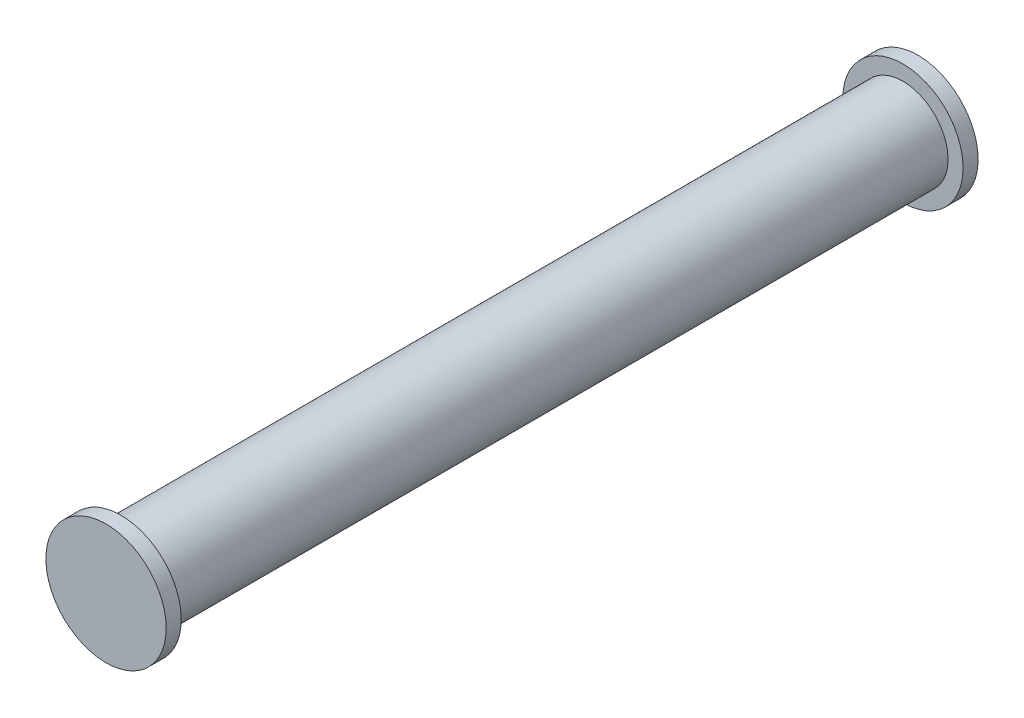
ISO-10303-21;
HEADER;
FILE_DESCRIPTION(('STEP AP214'),'2;1');
FILE_NAME('part.step','',(''),(''),'','','');
FILE_SCHEMA(('AUTOMOTIVE_DESIGN { 1 0 10303 214 1 1 1 1 }'));
ENDSEC;
DATA;
#1=APPLICATION_CONTEXT('core data for automotive mechanical design processes');
#2=APPLICATION_PROTOCOL_DEFINITION('international standard','automotive_design',2000,#1);
#3=PRODUCT_CONTEXT('',#1,'mechanical');
#4=PRODUCT('Part','Part','',(#3));
#5=PRODUCT_RELATED_PRODUCT_CATEGORY('part','',(#4));
#6=PRODUCT_DEFINITION_FORMATION('','',#4);
#7=PRODUCT_DEFINITION_CONTEXT('part definition',#1,'design');
#8=PRODUCT_DEFINITION('design','',#6,#7);
#9=PRODUCT_DEFINITION_SHAPE('','',#8);
#10=(LENGTH_UNIT() NAMED_UNIT(*) SI_UNIT(.MILLI.,.METRE.));
#11=(NAMED_UNIT(*) PLANE_ANGLE_UNIT() SI_UNIT($,.RADIAN.));
#12=(NAMED_UNIT(*) SI_UNIT($,.STERADIAN.) SOLID_ANGLE_UNIT());
#13=UNCERTAINTY_MEASURE_WITH_UNIT(LENGTH_MEASURE(1.E-05),#10,'distance_accuracy_value','');
#14=(GEOMETRIC_REPRESENTATION_CONTEXT(3) GLOBAL_UNCERTAINTY_ASSIGNED_CONTEXT((#13)) GLOBAL_UNIT_ASSIGNED_CONTEXT((#10,
#11,#12)) REPRESENTATION_CONTEXT('',''));
#15=CARTESIAN_POINT('',(0.,0.,0.));
#16=DIRECTION('',(0.,0.,1.));
#17=DIRECTION('',(1.,0.,0.));
#18=AXIS2_PLACEMENT_3D('',#15,#16,#17);
#19=CARTESIAN_POINT('',(0.,0.,26.));
#20=DIRECTION('',(0.,0.,-1.));
#21=DIRECTION('',(-1.,0.,0.));
#22=AXIS2_PLACEMENT_3D('',#19,#20,#21);
#23=CYLINDRICAL_SURFACE('',#22,1.5);
#24=CARTESIAN_POINT('',(0.,0.,26.));
#25=DIRECTION('',(0.,0.,1.));
#26=DIRECTION('',(1.,0.,0.));
#27=AXIS2_PLACEMENT_3D('',#24,#25,#26);
#28=CIRCLE('',#27,1.5);
#29=CARTESIAN_POINT('',(-1.5,0.,26.));
#30=VERTEX_POINT('',#29);
#31=EDGE_CURVE('E10',#30,#30,#28,.T.);
#32=CARTESIAN_POINT('',(0.,0.,0.));
#33=DIRECTION('',(0.,0.,-1.));
#34=DIRECTION('',(-1.,0.,0.));
#35=AXIS2_PLACEMENT_3D('',#32,#33,#34);
#36=CIRCLE('',#35,1.5);
#37=CARTESIAN_POINT('',(-1.5,0.,0.));
#38=VERTEX_POINT('',#37);
#39=EDGE_CURVE('E46',#38,#38,#36,.T.);
#40=CARTESIAN_POINT('',(-1.5,0.,26.));
#41=CARTESIAN_POINT('',(-1.5,0.,25.7291666666667));
#42=CARTESIAN_POINT('',(-1.5,0.,25.4583333333333));
#43=CARTESIAN_POINT('',(-1.5,0.,24.9166666666667));
#44=CARTESIAN_POINT('',(-1.5,0.,24.6458333333333));
#45=CARTESIAN_POINT('',(-1.5,0.,24.1041666666667));
#46=CARTESIAN_POINT('',(-1.5,0.,23.8333333333333));
#47=CARTESIAN_POINT('',(-1.5,0.,23.2916666666667));
#48=CARTESIAN_POINT('',(-1.5,0.,23.0208333333333));
#49=CARTESIAN_POINT('',(-1.5,0.,22.4791666666667));
#50=CARTESIAN_POINT('',(-1.5,0.,22.2083333333333));
#51=CARTESIAN_POINT('',(-1.5,0.,21.6666666666667));
#52=CARTESIAN_POINT('',(-1.5,0.,21.3958333333333));
#53=CARTESIAN_POINT('',(-1.5,0.,20.8541666666667));
#54=CARTESIAN_POINT('',(-1.5,0.,20.5833333333333));
#55=CARTESIAN_POINT('',(-1.5,0.,20.0416666666667));
#56=CARTESIAN_POINT('',(-1.5,0.,19.7708333333333));
#57=CARTESIAN_POINT('',(-1.5,0.,19.2291666666667));
#58=CARTESIAN_POINT('',(-1.5,0.,18.9583333333333));
#59=CARTESIAN_POINT('',(-1.5,0.,18.4166666666667));
#60=CARTESIAN_POINT('',(-1.5,0.,18.1458333333333));
#61=CARTESIAN_POINT('',(-1.5,0.,17.6041666666667));
#62=CARTESIAN_POINT('',(-1.5,0.,17.3333333333333));
#63=CARTESIAN_POINT('',(-1.5,0.,16.7916666666667));
#64=CARTESIAN_POINT('',(-1.5,0.,16.5208333333333));
#65=CARTESIAN_POINT('',(-1.5,0.,15.9791666666667));
#66=CARTESIAN_POINT('',(-1.5,0.,15.7083333333333));
#67=CARTESIAN_POINT('',(-1.5,0.,15.1666666666667));
#68=CARTESIAN_POINT('',(-1.5,0.,14.8958333333333));
#69=CARTESIAN_POINT('',(-1.5,0.,14.3541666666667));
#70=CARTESIAN_POINT('',(-1.5,0.,14.0833333333333));
#71=CARTESIAN_POINT('',(-1.5,0.,13.5416666666667));
#72=CARTESIAN_POINT('',(-1.5,0.,13.2708333333333));
#73=CARTESIAN_POINT('',(-1.5,0.,12.7291666666667));
#74=CARTESIAN_POINT('',(-1.5,0.,12.4583333333333));
#75=CARTESIAN_POINT('',(-1.5,0.,11.9166666666667));
#76=CARTESIAN_POINT('',(-1.5,0.,11.6458333333333));
#77=CARTESIAN_POINT('',(-1.5,0.,11.1041666666667));
#78=CARTESIAN_POINT('',(-1.5,0.,10.8333333333333));
#79=CARTESIAN_POINT('',(-1.5,0.,10.2916666666667));
#80=CARTESIAN_POINT('',(-1.5,0.,10.0208333333333));
#81=CARTESIAN_POINT('',(-1.5,0.,9.47916666666667));
#82=CARTESIAN_POINT('',(-1.5,0.,9.20833333333333));
#83=CARTESIAN_POINT('',(-1.5,0.,8.66666666666667));
#84=CARTESIAN_POINT('',(-1.5,0.,8.39583333333333));
#85=CARTESIAN_POINT('',(-1.5,0.,7.85416666666667));
#86=CARTESIAN_POINT('',(-1.5,0.,7.58333333333333));
#87=CARTESIAN_POINT('',(-1.5,0.,7.04166666666667));
#88=CARTESIAN_POINT('',(-1.5,0.,6.77083333333333));
#89=CARTESIAN_POINT('',(-1.5,0.,6.22916666666667));
#90=CARTESIAN_POINT('',(-1.5,0.,5.95833333333333));
#91=CARTESIAN_POINT('',(-1.5,0.,5.41666666666667));
#92=CARTESIAN_POINT('',(-1.5,0.,5.14583333333333));
#93=CARTESIAN_POINT('',(-1.5,0.,4.60416666666667));
#94=CARTESIAN_POINT('',(-1.5,0.,4.33333333333333));
#95=CARTESIAN_POINT('',(-1.5,0.,3.79166666666667));
#96=CARTESIAN_POINT('',(-1.5,0.,3.52083333333333));
#97=CARTESIAN_POINT('',(-1.5,0.,2.97916666666667));
#98=CARTESIAN_POINT('',(-1.5,0.,2.70833333333333));
#99=CARTESIAN_POINT('',(-1.5,0.,2.16666666666667));
#100=CARTESIAN_POINT('',(-1.5,0.,1.89583333333333));
#101=CARTESIAN_POINT('',(-1.5,0.,1.35416666666667));
#102=CARTESIAN_POINT('',(-1.5,0.,1.08333333333333));
#103=CARTESIAN_POINT('',(-1.5,0.,0.541666666666667));
#104=CARTESIAN_POINT('',(-1.5,0.,0.270833333333334));
#105=CARTESIAN_POINT('',(-1.5,0.,0.));
#106=B_SPLINE_CURVE_WITH_KNOTS('',3,(#40,#41,#42,#43,#44,#45,#46,#47,#48,#49,#50,#51,#52,#53,
#54,#55,#56,#57,#58,#59,#60,#61,#62,#63,#64,#65,#66,#67,#68,#69,#70,#71,#72,#73,#74,#75,#76,#77,
#78,#79,#80,#81,#82,#83,#84,#85,#86,#87,#88,#89,#90,#91,#92,#93,#94,#95,#96,#97,#98,#99,#100,
#101,#102,#103,#104,#105),.UNSPECIFIED.,.F.,.F.,(4,2,2,2,2,2,2,2,2,2,2,2,2,2,2,2,2,2,2,2,2,2,2,
2,2,2,2,2,2,2,2,2,4),(0.,0.812500000000001,1.625,2.4375,3.25,4.0625,4.875,5.6875,6.5,7.3125,
8.125,8.9375,9.75,10.5625,11.375,12.1875,13.,13.8125,14.625,15.4375,16.25,17.0625,17.875,
18.6875,19.5,20.3125,21.125,21.9375,22.75,23.5625,24.375,25.1875,26.),.UNSPECIFIED.);
#107=EDGE_CURVE('BSEAM31',#30,#38,#106,.T.);
#108=ORIENTED_EDGE('',*,*,#31,.F.);
#109=ORIENTED_EDGE('',*,*,#39,.F.);
#110=ORIENTED_EDGE('',*,*,#107,.T.);
#111=ORIENTED_EDGE('',*,*,#107,.F.);
#112=EDGE_LOOP('',(#108,#110,#109,#111));
#113=FACE_BOUND('',#112,.T.);
#114=ADVANCED_FACE('F31',(#113),#23,.T.);
#115=CARTESIAN_POINT('',(0.,0.,26.5));
#116=DIRECTION('',(0.,0.,-1.));
#117=DIRECTION('',(-1.,0.,0.));
#118=AXIS2_PLACEMENT_3D('',#115,#116,#117);
#119=CYLINDRICAL_SURFACE('',#118,2.);
#120=CARTESIAN_POINT('',(0.,0.,26.5));
#121=DIRECTION('',(0.,0.,1.));
#122=DIRECTION('',(1.,0.,0.));
#123=AXIS2_PLACEMENT_3D('',#120,#121,#122);
#124=CIRCLE('',#123,2.);
#125=CARTESIAN_POINT('',(2.,0.,26.5));
#126=VERTEX_POINT('',#125);
#127=EDGE_CURVE('E37',#126,#126,#124,.T.);
#128=ORIENTED_EDGE('',*,*,#127,.F.);
#129=EDGE_LOOP('',(#128));
#130=FACE_BOUND('',#129,.T.);
#131=CARTESIAN_POINT('',(0.,0.,26.));
#132=DIRECTION('',(0.,0.,1.));
#133=DIRECTION('',(1.,0.,0.));
#134=AXIS2_PLACEMENT_3D('',#131,#132,#133);
#135=CIRCLE('',#134,2.);
#136=CARTESIAN_POINT('',(2.,0.,26.));
#137=VERTEX_POINT('',#136);
#138=EDGE_CURVE('E41',#137,#137,#135,.T.);
#139=ORIENTED_EDGE('',*,*,#138,.T.);
#140=EDGE_LOOP('',(#139));
#141=FACE_BOUND('',#140,.T.);
#142=ADVANCED_FACE('F75',(#130,#141),#119,.T.);
#143=CARTESIAN_POINT('',(0.,0.,26.5));
#144=DIRECTION('',(0.,0.,1.));
#145=DIRECTION('',(1.,0.,0.));
#146=AXIS2_PLACEMENT_3D('',#143,#144,#145);
#147=PLANE('',#146);
#148=ORIENTED_EDGE('',*,*,#127,.T.);
#149=EDGE_LOOP('',(#148));
#150=FACE_BOUND('',#149,.T.);
#151=ADVANCED_FACE('F80',(#150),#147,.T.);
#152=CARTESIAN_POINT('',(0.,0.,26.));
#153=DIRECTION('',(0.,0.,1.));
#154=DIRECTION('',(1.,0.,0.));
#155=AXIS2_PLACEMENT_3D('',#152,#153,#154);
#156=PLANE('',#155);
#157=ORIENTED_EDGE('',*,*,#31,.T.);
#158=EDGE_LOOP('',(#157));
#159=FACE_BOUND('',#158,.T.);
#160=ORIENTED_EDGE('',*,*,#138,.F.);
#161=EDGE_LOOP('',(#160));
#162=FACE_BOUND('',#161,.T.);
#163=ADVANCED_FACE('F62',(#159,#162),#156,.F.);
#164=CARTESIAN_POINT('',(0.,0.,-0.5));
#165=DIRECTION('',(0.,0.,1.));
#166=DIRECTION('',(1.,0.,0.));
#167=AXIS2_PLACEMENT_3D('',#164,#165,#166);
#168=CYLINDRICAL_SURFACE('',#167,2.);
#169=CARTESIAN_POINT('',(0.,0.,-0.5));
#170=DIRECTION('',(0.,0.,-1.));
#171=DIRECTION('',(-1.,0.,0.));
#172=AXIS2_PLACEMENT_3D('',#169,#170,#171);
#173=CIRCLE('',#172,2.);
#174=CARTESIAN_POINT('',(-2.,0.,-0.5));
#175=VERTEX_POINT('',#174);
#176=EDGE_CURVE('E50',#175,#175,#173,.T.);
#177=ORIENTED_EDGE('',*,*,#176,.F.);
#178=EDGE_LOOP('',(#177));
#179=FACE_BOUND('',#178,.T.);
#180=CARTESIAN_POINT('',(0.,0.,0.));
#181=DIRECTION('',(0.,0.,-1.));
#182=DIRECTION('',(-1.,0.,0.));
#183=AXIS2_PLACEMENT_3D('',#180,#181,#182);
#184=CIRCLE('',#183,2.);
#185=CARTESIAN_POINT('',(-2.,0.,0.));
#186=VERTEX_POINT('',#185);
#187=EDGE_CURVE('E51',#186,#186,#184,.T.);
#188=ORIENTED_EDGE('',*,*,#187,.T.);
#189=EDGE_LOOP('',(#188));
#190=FACE_BOUND('',#189,.T.);
#191=ADVANCED_FACE('F59',(#179,#190),#168,.T.);
#192=CARTESIAN_POINT('',(0.,0.,-0.5));
#193=DIRECTION('',(0.,0.,-1.));
#194=DIRECTION('',(-1.,0.,0.));
#195=AXIS2_PLACEMENT_3D('',#192,#193,#194);
#196=PLANE('',#195);
#197=ORIENTED_EDGE('',*,*,#176,.T.);
#198=EDGE_LOOP('',(#197));
#199=FACE_BOUND('',#198,.T.);
#200=ADVANCED_FACE('F57',(#199),#196,.T.);
#201=CARTESIAN_POINT('',(0.,0.,0.));
#202=DIRECTION('',(0.,0.,-1.));
#203=DIRECTION('',(-1.,0.,0.));
#204=AXIS2_PLACEMENT_3D('',#201,#202,#203);
#205=PLANE('',#204);
#206=ORIENTED_EDGE('',*,*,#39,.T.);
#207=EDGE_LOOP('',(#206));
#208=FACE_BOUND('',#207,.T.);
#209=ORIENTED_EDGE('',*,*,#187,.F.);
#210=EDGE_LOOP('',(#209));
#211=FACE_BOUND('',#210,.T.);
#212=ADVANCED_FACE('F66',(#208,#211),#205,.F.);
#213=CLOSED_SHELL('',(#114,#142,#151,#163,#191,#200,#212));
#214=MANIFOLD_SOLID_BREP('B2',#213);
#215=ADVANCED_BREP_SHAPE_REPRESENTATION('',(#18,#214),#14);
#216=SHAPE_DEFINITION_REPRESENTATION(#9,#215);
ENDSEC;
END-ISO-10303-21;
